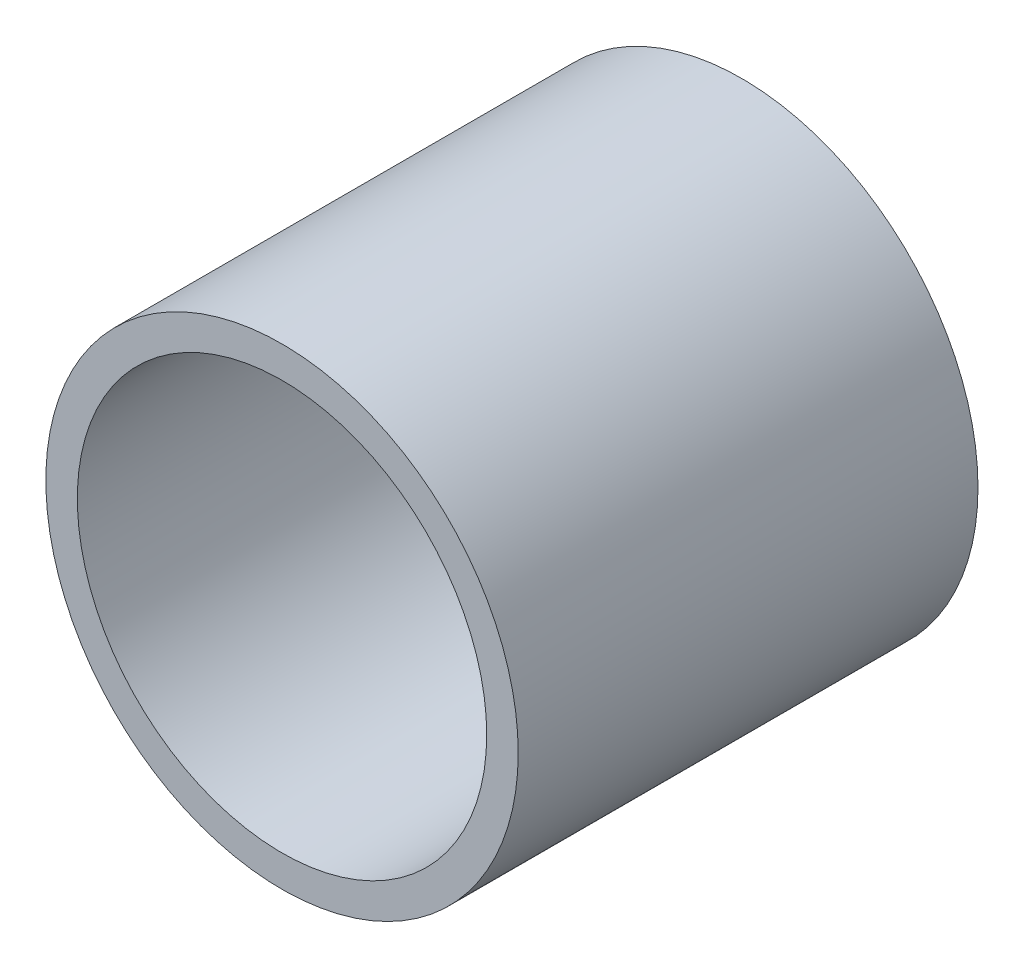
ISO-10303-21;
HEADER;
FILE_DESCRIPTION(('STEP AP214'),'2;1');
FILE_NAME('part.step','',(''),(''),'','','');
FILE_SCHEMA(('AUTOMOTIVE_DESIGN { 1 0 10303 214 1 1 1 1 }'));
ENDSEC;
DATA;
#1=APPLICATION_CONTEXT('core data for automotive mechanical design processes');
#2=APPLICATION_PROTOCOL_DEFINITION('international standard','automotive_design',2000,#1);
#3=PRODUCT_CONTEXT('',#1,'mechanical');
#4=PRODUCT('Part','Part','',(#3));
#5=PRODUCT_RELATED_PRODUCT_CATEGORY('part','',(#4));
#6=PRODUCT_DEFINITION_FORMATION('','',#4);
#7=PRODUCT_DEFINITION_CONTEXT('part definition',#1,'design');
#8=PRODUCT_DEFINITION('design','',#6,#7);
#9=PRODUCT_DEFINITION_SHAPE('','',#8);
#10=(LENGTH_UNIT() NAMED_UNIT(*) SI_UNIT(.MILLI.,.METRE.));
#11=(NAMED_UNIT(*) PLANE_ANGLE_UNIT() SI_UNIT($,.RADIAN.));
#12=(NAMED_UNIT(*) SI_UNIT($,.STERADIAN.) SOLID_ANGLE_UNIT());
#13=UNCERTAINTY_MEASURE_WITH_UNIT(LENGTH_MEASURE(1.E-05),#10,'distance_accuracy_value','');
#14=(GEOMETRIC_REPRESENTATION_CONTEXT(3) GLOBAL_UNCERTAINTY_ASSIGNED_CONTEXT((#13)) GLOBAL_UNIT_ASSIGNED_CONTEXT((#10,
#11,#12)) REPRESENTATION_CONTEXT('',''));
#15=CARTESIAN_POINT('',(0.,0.,0.));
#16=DIRECTION('',(0.,0.,1.));
#17=DIRECTION('',(1.,0.,0.));
#18=AXIS2_PLACEMENT_3D('',#15,#16,#17);
#19=CARTESIAN_POINT('',(0.,0.,7.3));
#20=DIRECTION('',(0.,0.,1.));
#21=DIRECTION('',(1.,0.,0.));
#22=AXIS2_PLACEMENT_3D('',#19,#20,#21);
#23=PLANE('',#22);
#24=CARTESIAN_POINT('',(0.,0.,7.3));
#25=DIRECTION('',(0.,0.,1.));
#26=DIRECTION('',(1.,0.,0.));
#27=AXIS2_PLACEMENT_3D('',#24,#25,#26);
#28=CIRCLE('',#27,3.75);
#29=CARTESIAN_POINT('',(3.75,0.,7.3));
#30=VERTEX_POINT('',#29);
#31=EDGE_CURVE('E10',#30,#30,#28,.T.);
#32=ORIENTED_EDGE('',*,*,#31,.T.);
#33=EDGE_LOOP('',(#32));
#34=FACE_BOUND('',#33,.T.);
#35=CARTESIAN_POINT('',(0.,0.,7.3));
#36=DIRECTION('',(0.,0.,1.));
#37=DIRECTION('',(1.,0.,0.));
#38=AXIS2_PLACEMENT_3D('',#35,#36,#37);
#39=CIRCLE('',#38,3.25);
#40=CARTESIAN_POINT('',(3.25,0.,7.3));
#41=VERTEX_POINT('',#40);
#42=EDGE_CURVE('E41',#41,#41,#39,.T.);
#43=ORIENTED_EDGE('',*,*,#42,.F.);
#44=EDGE_LOOP('',(#43));
#45=FACE_BOUND('',#44,.T.);
#46=ADVANCED_FACE('F30',(#34,#45),#23,.T.);
#47=CARTESIAN_POINT('',(0.,0.,0.));
#48=DIRECTION('',(0.,0.,1.));
#49=DIRECTION('',(1.,0.,0.));
#50=AXIS2_PLACEMENT_3D('',#47,#48,#49);
#51=PLANE('',#50);
#52=CARTESIAN_POINT('',(0.,0.,0.));
#53=DIRECTION('',(0.,0.,1.));
#54=DIRECTION('',(1.,0.,0.));
#55=AXIS2_PLACEMENT_3D('',#52,#53,#54);
#56=CIRCLE('',#55,3.75);
#57=CARTESIAN_POINT('',(3.75,0.,0.));
#58=VERTEX_POINT('',#57);
#59=EDGE_CURVE('E34',#58,#58,#56,.T.);
#60=ORIENTED_EDGE('',*,*,#59,.F.);
#61=EDGE_LOOP('',(#60));
#62=FACE_BOUND('',#61,.T.);
#63=CARTESIAN_POINT('',(0.,0.,0.));
#64=DIRECTION('',(0.,0.,1.));
#65=DIRECTION('',(1.,0.,0.));
#66=AXIS2_PLACEMENT_3D('',#63,#64,#65);
#67=CIRCLE('',#66,3.25);
#68=CARTESIAN_POINT('',(3.25,0.,0.));
#69=VERTEX_POINT('',#68);
#70=EDGE_CURVE('E43',#69,#69,#67,.T.);
#71=ORIENTED_EDGE('',*,*,#70,.T.);
#72=EDGE_LOOP('',(#71));
#73=FACE_BOUND('',#72,.T.);
#74=ADVANCED_FACE('F53',(#62,#73),#51,.F.);
#75=CARTESIAN_POINT('',(0.,0.,7.3));
#76=DIRECTION('',(0.,0.,-1.));
#77=DIRECTION('',(-1.,0.,0.));
#78=AXIS2_PLACEMENT_3D('',#75,#76,#77);
#79=CYLINDRICAL_SURFACE('',#78,3.75);
#80=ORIENTED_EDGE('',*,*,#31,.F.);
#81=EDGE_LOOP('',(#80));
#82=FACE_BOUND('',#81,.T.);
#83=ORIENTED_EDGE('',*,*,#59,.T.);
#84=EDGE_LOOP('',(#83));
#85=FACE_BOUND('',#84,.T.);
#86=ADVANCED_FACE('F32',(#82,#85),#79,.T.);
#87=CARTESIAN_POINT('',(0.,0.,7.3));
#88=DIRECTION('',(0.,0.,-1.));
#89=DIRECTION('',(-1.,0.,0.));
#90=AXIS2_PLACEMENT_3D('',#87,#88,#89);
#91=CYLINDRICAL_SURFACE('',#90,3.25);
#92=ORIENTED_EDGE('',*,*,#42,.T.);
#93=EDGE_LOOP('',(#92));
#94=FACE_BOUND('',#93,.T.);
#95=ORIENTED_EDGE('',*,*,#70,.F.);
#96=EDGE_LOOP('',(#95));
#97=FACE_BOUND('',#96,.T.);
#98=ADVANCED_FACE('F49',(#94,#97),#91,.F.);
#99=CLOSED_SHELL('',(#46,#74,#86,#98));
#100=MANIFOLD_SOLID_BREP('B2',#99);
#101=ADVANCED_BREP_SHAPE_REPRESENTATION('',(#18,#100),#14);
#102=SHAPE_DEFINITION_REPRESENTATION(#9,#101);
ENDSEC;
END-ISO-10303-21;
